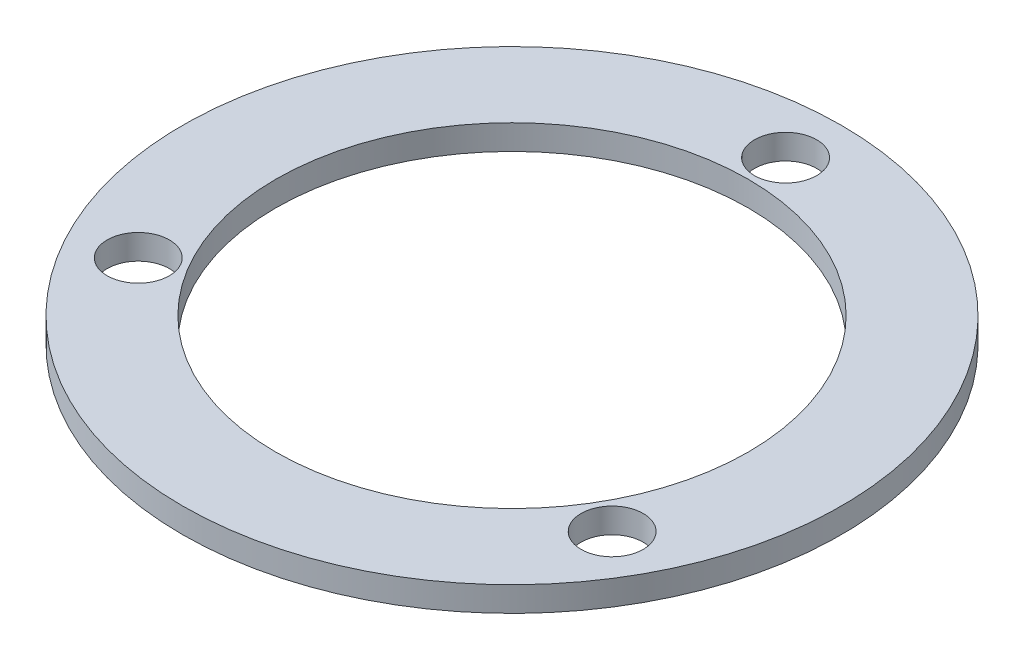
ISO-10303-21;
HEADER;
FILE_DESCRIPTION(('STEP AP214'),'2;1');
FILE_NAME('part.step','',(''),(''),'','','');
FILE_SCHEMA(('AUTOMOTIVE_DESIGN { 1 0 10303 214 1 1 1 1 }'));
ENDSEC;
DATA;
#1=APPLICATION_CONTEXT('core data for automotive mechanical design processes');
#2=APPLICATION_PROTOCOL_DEFINITION('international standard','automotive_design',2000,#1);
#3=PRODUCT_CONTEXT('',#1,'mechanical');
#4=PRODUCT('Part','Part','',(#3));
#5=PRODUCT_RELATED_PRODUCT_CATEGORY('part','',(#4));
#6=PRODUCT_DEFINITION_FORMATION('','',#4);
#7=PRODUCT_DEFINITION_CONTEXT('part definition',#1,'design');
#8=PRODUCT_DEFINITION('design','',#6,#7);
#9=PRODUCT_DEFINITION_SHAPE('','',#8);
#10=(LENGTH_UNIT() NAMED_UNIT(*) SI_UNIT(.MILLI.,.METRE.));
#11=(NAMED_UNIT(*) PLANE_ANGLE_UNIT() SI_UNIT($,.RADIAN.));
#12=(NAMED_UNIT(*) SI_UNIT($,.STERADIAN.) SOLID_ANGLE_UNIT());
#13=UNCERTAINTY_MEASURE_WITH_UNIT(LENGTH_MEASURE(1.E-05),#10,'distance_accuracy_value','');
#14=(GEOMETRIC_REPRESENTATION_CONTEXT(3) GLOBAL_UNCERTAINTY_ASSIGNED_CONTEXT((#13)) GLOBAL_UNIT_ASSIGNED_CONTEXT((#10,
#11,#12)) REPRESENTATION_CONTEXT('',''));
#15=CARTESIAN_POINT('',(0.,0.,0.));
#16=DIRECTION('',(0.,0.,1.));
#17=DIRECTION('',(1.,0.,0.));
#18=AXIS2_PLACEMENT_3D('',#15,#16,#17);
#19=CARTESIAN_POINT('',(0.,1.,0.));
#20=DIRECTION('',(0.,1.,0.));
#21=DIRECTION('',(0.,0.,1.));
#22=AXIS2_PLACEMENT_3D('',#19,#20,#21);
#23=PLANE('',#22);
#24=CARTESIAN_POINT('',(9.52627944162953,1.,5.49999999999959));
#25=DIRECTION('',(0.,1.,0.));
#26=DIRECTION('',(0.,0.,1.));
#27=AXIS2_PLACEMENT_3D('',#24,#25,#26);
#28=CIRCLE('',#27,1.25000000000061);
#29=CARTESIAN_POINT('',(9.52627944162953,1.,6.7500000000002));
#30=VERTEX_POINT('',#29);
#31=EDGE_CURVE('E68',#30,#30,#28,.T.);
#32=ORIENTED_EDGE('',*,*,#31,.F.);
#33=EDGE_LOOP('',(#32));
#34=FACE_BOUND('',#33,.T.);
#35=CARTESIAN_POINT('',(0.,1.,0.));
#36=DIRECTION('',(0.,1.,0.));
#37=DIRECTION('',(0.,0.,1.));
#38=AXIS2_PLACEMENT_3D('',#35,#36,#37);
#39=CIRCLE('',#38,9.5);
#40=CARTESIAN_POINT('',(0.,1.,9.5));
#41=VERTEX_POINT('',#40);
#42=EDGE_CURVE('E54',#41,#41,#39,.T.);
#43=ORIENTED_EDGE('',*,*,#42,.F.);
#44=EDGE_LOOP('',(#43));
#45=FACE_BOUND('',#44,.T.);
#46=CARTESIAN_POINT('',(0.,1.,0.));
#47=DIRECTION('',(0.,1.,0.));
#48=DIRECTION('',(0.,0.,1.));
#49=AXIS2_PLACEMENT_3D('',#46,#47,#48);
#50=CIRCLE('',#49,13.25);
#51=CARTESIAN_POINT('',(0.,1.,13.25));
#52=VERTEX_POINT('',#51);
#53=EDGE_CURVE('E10',#52,#52,#50,.T.);
#54=ORIENTED_EDGE('',*,*,#53,.T.);
#55=EDGE_LOOP('',(#54));
#56=FACE_BOUND('',#55,.T.);
#57=CARTESIAN_POINT('',(0.,1.,-11.));
#58=DIRECTION('',(0.,1.,0.));
#59=DIRECTION('',(0.,0.,1.));
#60=AXIS2_PLACEMENT_3D('',#57,#58,#59);
#61=CIRCLE('',#60,1.25);
#62=CARTESIAN_POINT('',(0.,1.,-9.75));
#63=VERTEX_POINT('',#62);
#64=EDGE_CURVE('E60',#63,#63,#61,.T.);
#65=ORIENTED_EDGE('',*,*,#64,.F.);
#66=EDGE_LOOP('',(#65));
#67=FACE_BOUND('',#66,.T.);
#68=CARTESIAN_POINT('',(-9.52627944162812,1.,5.50000000000041));
#69=DIRECTION('',(0.,1.,0.));
#70=DIRECTION('',(0.,0.,1.));
#71=AXIS2_PLACEMENT_3D('',#68,#69,#70);
#72=CIRCLE('',#71,1.25000000000089);
#73=CARTESIAN_POINT('',(-9.52627944162812,1.,6.7500000000013));
#74=VERTEX_POINT('',#73);
#75=EDGE_CURVE('E76',#74,#74,#72,.T.);
#76=ORIENTED_EDGE('',*,*,#75,.F.);
#77=EDGE_LOOP('',(#76));
#78=FACE_BOUND('',#77,.T.);
#79=ADVANCED_FACE('F41',(#34,#45,#56,#67,#78),#23,.T.);
#80=CARTESIAN_POINT('',(0.,0.,0.));
#81=DIRECTION('',(0.,1.,0.));
#82=DIRECTION('',(0.,0.,1.));
#83=AXIS2_PLACEMENT_3D('',#80,#81,#82);
#84=PLANE('',#83);
#85=CARTESIAN_POINT('',(0.,0.,0.));
#86=DIRECTION('',(0.,1.,0.));
#87=DIRECTION('',(0.,0.,1.));
#88=AXIS2_PLACEMENT_3D('',#85,#86,#87);
#89=CIRCLE('',#88,13.25);
#90=CARTESIAN_POINT('',(0.,0.,13.25));
#91=VERTEX_POINT('',#90);
#92=EDGE_CURVE('E45',#91,#91,#89,.T.);
#93=ORIENTED_EDGE('',*,*,#92,.F.);
#94=EDGE_LOOP('',(#93));
#95=FACE_BOUND('',#94,.T.);
#96=CARTESIAN_POINT('',(0.,0.,0.));
#97=DIRECTION('',(0.,1.,0.));
#98=DIRECTION('',(0.,0.,1.));
#99=AXIS2_PLACEMENT_3D('',#96,#97,#98);
#100=CIRCLE('',#99,9.5);
#101=CARTESIAN_POINT('',(0.,0.,9.5));
#102=VERTEX_POINT('',#101);
#103=EDGE_CURVE('E56',#102,#102,#100,.T.);
#104=ORIENTED_EDGE('',*,*,#103,.T.);
#105=EDGE_LOOP('',(#104));
#106=FACE_BOUND('',#105,.T.);
#107=CARTESIAN_POINT('',(0.,0.,-11.));
#108=DIRECTION('',(0.,1.,0.));
#109=DIRECTION('',(0.,0.,1.));
#110=AXIS2_PLACEMENT_3D('',#107,#108,#109);
#111=CIRCLE('',#110,1.25);
#112=CARTESIAN_POINT('',(0.,0.,-9.75));
#113=VERTEX_POINT('',#112);
#114=EDGE_CURVE('E64',#113,#113,#111,.T.);
#115=ORIENTED_EDGE('',*,*,#114,.T.);
#116=EDGE_LOOP('',(#115));
#117=FACE_BOUND('',#116,.T.);
#118=CARTESIAN_POINT('',(9.52627944162953,0.,5.49999999999959));
#119=DIRECTION('',(0.,1.,0.));
#120=DIRECTION('',(0.,0.,1.));
#121=AXIS2_PLACEMENT_3D('',#118,#119,#120);
#122=CIRCLE('',#121,1.25000000000061);
#123=CARTESIAN_POINT('',(9.52627944162953,0.,6.7500000000002));
#124=VERTEX_POINT('',#123);
#125=EDGE_CURVE('E72',#124,#124,#122,.T.);
#126=ORIENTED_EDGE('',*,*,#125,.T.);
#127=EDGE_LOOP('',(#126));
#128=FACE_BOUND('',#127,.T.);
#129=CARTESIAN_POINT('',(-9.52627944162812,0.,5.50000000000041));
#130=DIRECTION('',(0.,1.,0.));
#131=DIRECTION('',(0.,0.,1.));
#132=AXIS2_PLACEMENT_3D('',#129,#130,#131);
#133=CIRCLE('',#132,1.25000000000089);
#134=CARTESIAN_POINT('',(-9.52627944162812,0.,6.7500000000013));
#135=VERTEX_POINT('',#134);
#136=EDGE_CURVE('E80',#135,#135,#133,.T.);
#137=ORIENTED_EDGE('',*,*,#136,.T.);
#138=EDGE_LOOP('',(#137));
#139=FACE_BOUND('',#138,.T.);
#140=ADVANCED_FACE('F92',(#95,#106,#117,#128,#139),#84,.F.);
#141=CARTESIAN_POINT('',(0.,1.,0.));
#142=DIRECTION('',(0.,-1.,0.));
#143=DIRECTION('',(0.,0.,-1.));
#144=AXIS2_PLACEMENT_3D('',#141,#142,#143);
#145=CYLINDRICAL_SURFACE('',#144,13.25);
#146=ORIENTED_EDGE('',*,*,#53,.F.);
#147=EDGE_LOOP('',(#146));
#148=FACE_BOUND('',#147,.T.);
#149=ORIENTED_EDGE('',*,*,#92,.T.);
#150=EDGE_LOOP('',(#149));
#151=FACE_BOUND('',#150,.T.);
#152=ADVANCED_FACE('F43',(#148,#151),#145,.T.);
#153=CARTESIAN_POINT('',(0.,1.,0.));
#154=DIRECTION('',(0.,-1.,0.));
#155=DIRECTION('',(0.,0.,-1.));
#156=AXIS2_PLACEMENT_3D('',#153,#154,#155);
#157=CYLINDRICAL_SURFACE('',#156,9.5);
#158=ORIENTED_EDGE('',*,*,#42,.T.);
#159=EDGE_LOOP('',(#158));
#160=FACE_BOUND('',#159,.T.);
#161=ORIENTED_EDGE('',*,*,#103,.F.);
#162=EDGE_LOOP('',(#161));
#163=FACE_BOUND('',#162,.T.);
#164=ADVANCED_FACE('F102',(#160,#163),#157,.F.);
#165=CARTESIAN_POINT('',(0.,1.,-11.));
#166=DIRECTION('',(0.,-1.,0.));
#167=DIRECTION('',(0.,0.,-1.));
#168=AXIS2_PLACEMENT_3D('',#165,#166,#167);
#169=CYLINDRICAL_SURFACE('',#168,1.25);
#170=ORIENTED_EDGE('',*,*,#64,.T.);
#171=EDGE_LOOP('',(#170));
#172=FACE_BOUND('',#171,.T.);
#173=ORIENTED_EDGE('',*,*,#114,.F.);
#174=EDGE_LOOP('',(#173));
#175=FACE_BOUND('',#174,.T.);
#176=ADVANCED_FACE('F105',(#172,#175),#169,.F.);
#177=CARTESIAN_POINT('',(9.52627944162953,1.,5.49999999999959));
#178=DIRECTION('',(0.,-1.,0.));
#179=DIRECTION('',(0.,0.,-1.));
#180=AXIS2_PLACEMENT_3D('',#177,#178,#179);
#181=CYLINDRICAL_SURFACE('',#180,1.25000000000061);
#182=ORIENTED_EDGE('',*,*,#31,.T.);
#183=EDGE_LOOP('',(#182));
#184=FACE_BOUND('',#183,.T.);
#185=ORIENTED_EDGE('',*,*,#125,.F.);
#186=EDGE_LOOP('',(#185));
#187=FACE_BOUND('',#186,.T.);
#188=ADVANCED_FACE('F109',(#184,#187),#181,.F.);
#189=CARTESIAN_POINT('',(-9.52627944162812,1.,5.50000000000041));
#190=DIRECTION('',(0.,-1.,0.));
#191=DIRECTION('',(0.,0.,-1.));
#192=AXIS2_PLACEMENT_3D('',#189,#190,#191);
#193=CYLINDRICAL_SURFACE('',#192,1.25000000000089);
#194=ORIENTED_EDGE('',*,*,#75,.T.);
#195=EDGE_LOOP('',(#194));
#196=FACE_BOUND('',#195,.T.);
#197=ORIENTED_EDGE('',*,*,#136,.F.);
#198=EDGE_LOOP('',(#197));
#199=FACE_BOUND('',#198,.T.);
#200=ADVANCED_FACE('F88',(#196,#199),#193,.F.);
#201=CLOSED_SHELL('',(#79,#140,#152,#164,#176,#188,#200));
#202=MANIFOLD_SOLID_BREP('B2',#201);
#203=ADVANCED_BREP_SHAPE_REPRESENTATION('',(#18,#202),#14);
#204=SHAPE_DEFINITION_REPRESENTATION(#9,#203);
ENDSEC;
END-ISO-10303-21;
